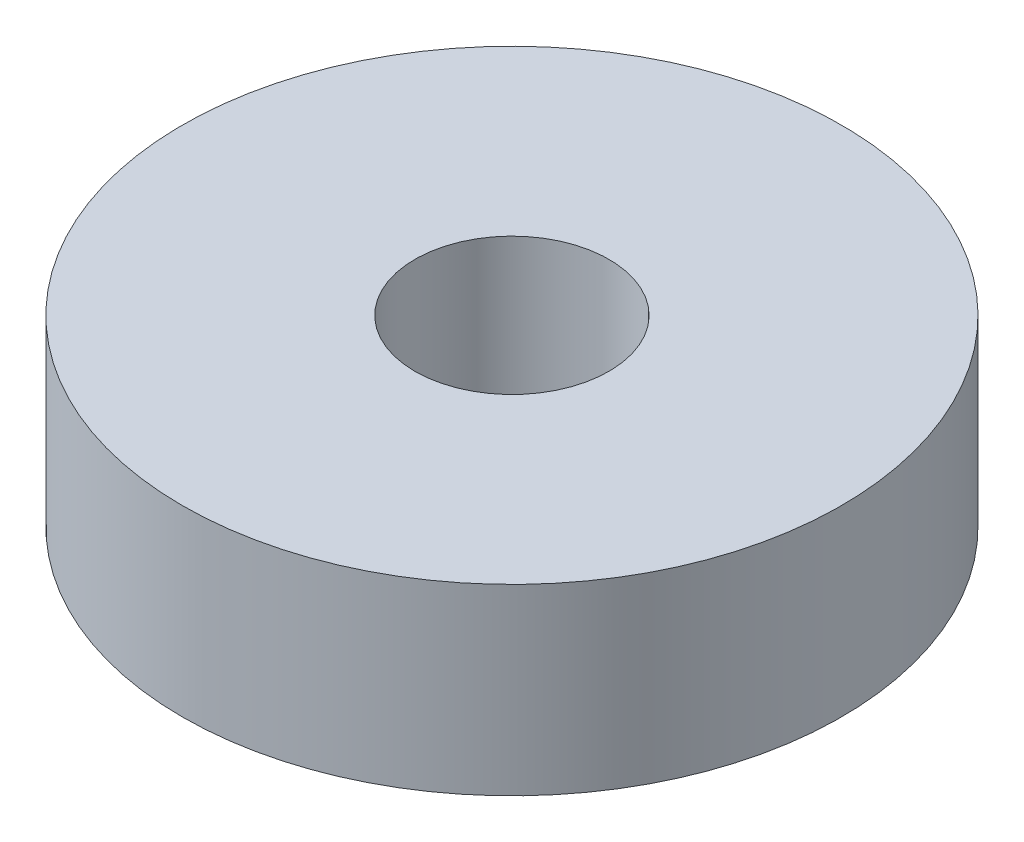
ISO-10303-21;
HEADER;
FILE_DESCRIPTION(('STEP AP214'),'2;1');
FILE_NAME('part.step','',(''),(''),'','','');
FILE_SCHEMA(('AUTOMOTIVE_DESIGN { 1 0 10303 214 1 1 1 1 }'));
ENDSEC;
DATA;
#1=APPLICATION_CONTEXT('core data for automotive mechanical design processes');
#2=APPLICATION_PROTOCOL_DEFINITION('international standard','automotive_design',2000,#1);
#3=PRODUCT_CONTEXT('',#1,'mechanical');
#4=PRODUCT('Part','Part','',(#3));
#5=PRODUCT_RELATED_PRODUCT_CATEGORY('part','',(#4));
#6=PRODUCT_DEFINITION_FORMATION('','',#4);
#7=PRODUCT_DEFINITION_CONTEXT('part definition',#1,'design');
#8=PRODUCT_DEFINITION('design','',#6,#7);
#9=PRODUCT_DEFINITION_SHAPE('','',#8);
#10=(LENGTH_UNIT() NAMED_UNIT(*) SI_UNIT(.MILLI.,.METRE.));
#11=(NAMED_UNIT(*) PLANE_ANGLE_UNIT() SI_UNIT($,.RADIAN.));
#12=(NAMED_UNIT(*) SI_UNIT($,.STERADIAN.) SOLID_ANGLE_UNIT());
#13=UNCERTAINTY_MEASURE_WITH_UNIT(LENGTH_MEASURE(1.E-05),#10,'distance_accuracy_value','');
#14=(GEOMETRIC_REPRESENTATION_CONTEXT(3) GLOBAL_UNCERTAINTY_ASSIGNED_CONTEXT((#13)) GLOBAL_UNIT_ASSIGNED_CONTEXT((#10,
#11,#12)) REPRESENTATION_CONTEXT('',''));
#15=CARTESIAN_POINT('',(0.,0.,0.));
#16=DIRECTION('',(0.,0.,1.));
#17=DIRECTION('',(1.,0.,0.));
#18=AXIS2_PLACEMENT_3D('',#15,#16,#17);
#19=CARTESIAN_POINT('',(0.,5.,0.));
#20=DIRECTION('',(0.,-1.,0.));
#21=DIRECTION('',(0.,0.,-1.));
#22=AXIS2_PLACEMENT_3D('',#19,#20,#21);
#23=CYLINDRICAL_SURFACE('',#22,9.);
#24=CARTESIAN_POINT('',(0.,5.,0.));
#25=DIRECTION('',(0.,1.,0.));
#26=DIRECTION('',(0.,0.,1.));
#27=AXIS2_PLACEMENT_3D('',#24,#25,#26);
#28=CIRCLE('',#27,9.);
#29=CARTESIAN_POINT('',(0.,5.,9.));
#30=VERTEX_POINT('',#29);
#31=EDGE_CURVE('E10',#30,#30,#28,.T.);
#32=ORIENTED_EDGE('',*,*,#31,.F.);
#33=EDGE_LOOP('',(#32));
#34=FACE_BOUND('',#33,.T.);
#35=CARTESIAN_POINT('',(0.,0.,0.));
#36=DIRECTION('',(0.,1.,0.));
#37=DIRECTION('',(0.,0.,1.));
#38=AXIS2_PLACEMENT_3D('',#35,#36,#37);
#39=CIRCLE('',#38,9.);
#40=CARTESIAN_POINT('',(0.,0.,9.));
#41=VERTEX_POINT('',#40);
#42=EDGE_CURVE('E46',#41,#41,#39,.T.);
#43=ORIENTED_EDGE('',*,*,#42,.T.);
#44=EDGE_LOOP('',(#43));
#45=FACE_BOUND('',#44,.T.);
#46=ADVANCED_FACE('F43',(#34,#45),#23,.T.);
#47=CARTESIAN_POINT('',(0.,5.,0.));
#48=DIRECTION('',(0.,1.,0.));
#49=DIRECTION('',(0.,0.,1.));
#50=AXIS2_PLACEMENT_3D('',#47,#48,#49);
#51=PLANE('',#50);
#52=CARTESIAN_POINT('',(0.,5.,0.));
#53=DIRECTION('',(0.,1.,0.));
#54=DIRECTION('',(0.,0.,1.));
#55=AXIS2_PLACEMENT_3D('',#52,#53,#54);
#56=CIRCLE('',#55,2.65);
#57=CARTESIAN_POINT('',(0.,5.,2.65));
#58=VERTEX_POINT('',#57);
#59=EDGE_CURVE('E57',#58,#58,#56,.T.);
#60=ORIENTED_EDGE('',*,*,#59,.F.);
#61=EDGE_LOOP('',(#60));
#62=FACE_BOUND('',#61,.T.);
#63=ORIENTED_EDGE('',*,*,#31,.T.);
#64=EDGE_LOOP('',(#63));
#65=FACE_BOUND('',#64,.T.);
#66=ADVANCED_FACE('F74',(#62,#65),#51,.T.);
#67=CARTESIAN_POINT('',(0.,0.,0.));
#68=DIRECTION('',(0.,1.,0.));
#69=DIRECTION('',(0.,0.,1.));
#70=AXIS2_PLACEMENT_3D('',#67,#68,#69);
#71=PLANE('',#70);
#72=CARTESIAN_POINT('',(0.,0.,0.));
#73=DIRECTION('',(0.,1.,0.));
#74=DIRECTION('',(0.,0.,1.));
#75=AXIS2_PLACEMENT_3D('',#72,#73,#74);
#76=CIRCLE('',#75,2.65);
#77=CARTESIAN_POINT('',(0.,0.,2.65));
#78=VERTEX_POINT('',#77);
#79=EDGE_CURVE('E55',#78,#78,#76,.T.);
#80=ORIENTED_EDGE('',*,*,#79,.T.);
#81=EDGE_LOOP('',(#80));
#82=FACE_BOUND('',#81,.T.);
#83=ORIENTED_EDGE('',*,*,#42,.F.);
#84=EDGE_LOOP('',(#83));
#85=FACE_BOUND('',#84,.T.);
#86=ADVANCED_FACE('F65',(#82,#85),#71,.F.);
#87=CARTESIAN_POINT('',(0.,0.,0.));
#88=DIRECTION('',(0.,1.,0.));
#89=DIRECTION('',(0.,0.,1.));
#90=AXIS2_PLACEMENT_3D('',#87,#88,#89);
#91=CYLINDRICAL_SURFACE('',#90,2.65);
#92=ORIENTED_EDGE('',*,*,#79,.F.);
#93=EDGE_LOOP('',(#92));
#94=FACE_BOUND('',#93,.T.);
#95=ORIENTED_EDGE('',*,*,#59,.T.);
#96=EDGE_LOOP('',(#95));
#97=FACE_BOUND('',#96,.T.);
#98=ADVANCED_FACE('F68',(#94,#97),#91,.F.);
#99=CLOSED_SHELL('',(#46,#66,#86,#98));
#100=MANIFOLD_SOLID_BREP('B2',#99);
#101=ADVANCED_BREP_SHAPE_REPRESENTATION('',(#18,#100),#14);
#102=SHAPE_DEFINITION_REPRESENTATION(#9,#101);
ENDSEC;
END-ISO-10303-21;
